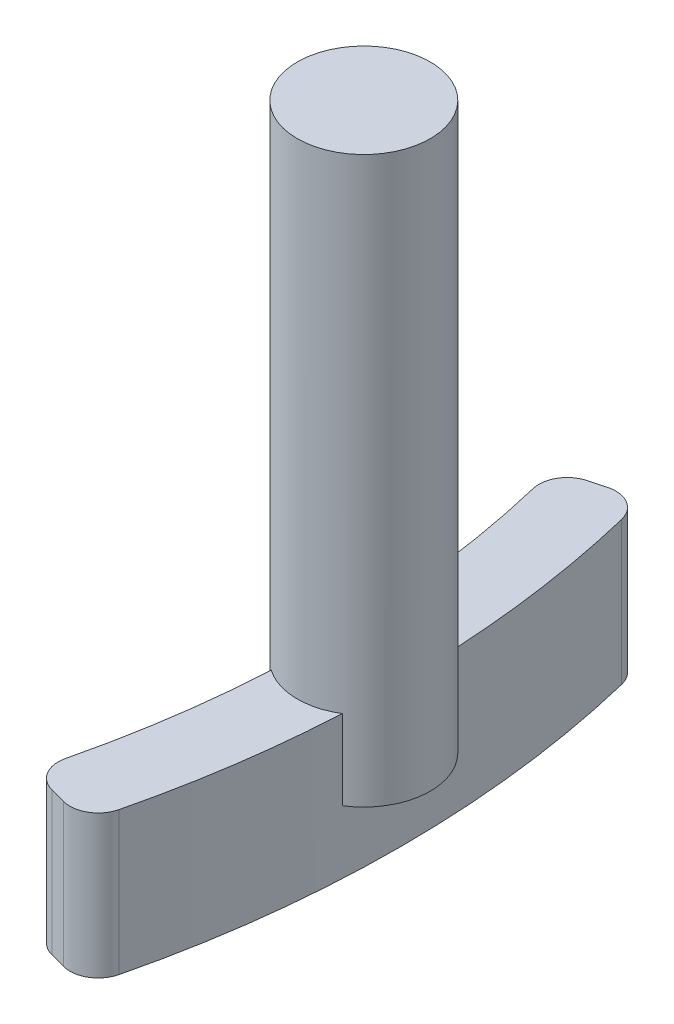
ISO-10303-21;
HEADER;
FILE_DESCRIPTION(('STEP AP214'),'2;1');
FILE_NAME('part.step','',(''),(''),'','','');
FILE_SCHEMA(('AUTOMOTIVE_DESIGN { 1 0 10303 214 1 1 1 1 }'));
ENDSEC;
DATA;
#1=APPLICATION_CONTEXT('core data for automotive mechanical design processes');
#2=APPLICATION_PROTOCOL_DEFINITION('international standard','automotive_design',2000,#1);
#3=PRODUCT_CONTEXT('',#1,'mechanical');
#4=PRODUCT('Part','Part','',(#3));
#5=PRODUCT_RELATED_PRODUCT_CATEGORY('part','',(#4));
#6=PRODUCT_DEFINITION_FORMATION('','',#4);
#7=PRODUCT_DEFINITION_CONTEXT('part definition',#1,'design');
#8=PRODUCT_DEFINITION('design','',#6,#7);
#9=PRODUCT_DEFINITION_SHAPE('','',#8);
#10=(LENGTH_UNIT() NAMED_UNIT(*) SI_UNIT(.MILLI.,.METRE.));
#11=(NAMED_UNIT(*) PLANE_ANGLE_UNIT() SI_UNIT($,.RADIAN.));
#12=(NAMED_UNIT(*) SI_UNIT($,.STERADIAN.) SOLID_ANGLE_UNIT());
#13=UNCERTAINTY_MEASURE_WITH_UNIT(LENGTH_MEASURE(1.E-05),#10,'distance_accuracy_value','');
#14=(GEOMETRIC_REPRESENTATION_CONTEXT(3) GLOBAL_UNCERTAINTY_ASSIGNED_CONTEXT((#13)) GLOBAL_UNIT_ASSIGNED_CONTEXT((#10,
#11,#12)) REPRESENTATION_CONTEXT('',''));
#15=CARTESIAN_POINT('',(0.,0.,0.));
#16=DIRECTION('',(0.,0.,1.));
#17=DIRECTION('',(1.,0.,0.));
#18=AXIS2_PLACEMENT_3D('',#15,#16,#17);
#19=CARTESIAN_POINT('',(-30.5687487202427,4.3,-6.82173660494919E-13));
#20=DIRECTION('',(0.,-1.,0.));
#21=DIRECTION('',(0.,0.,-1.));
#22=AXIS2_PLACEMENT_3D('',#19,#20,#21);
#23=CYLINDRICAL_SURFACE('',#22,32.0999999999997);
#24=DIRECTION('',(0.,-1.,0.));
#25=VECTOR('',#24,1.);
#26=CARTESIAN_POINT('',(1.48625127975695,10.4,1.69911006117922));
#27=LINE('',#26,#25);
#28=CARTESIAN_POINT('',(1.4862512797569,4.3,1.69911006117915));
#29=VERTEX_POINT('',#28);
#30=CARTESIAN_POINT('',(1.48625127975689,1.9,1.69911006117926));
#31=VERTEX_POINT('',#30);
#32=EDGE_CURVE('E201',#29,#31,#27,.T.);
#33=ORIENTED_EDGE('',*,*,#32,.F.);
#34=CARTESIAN_POINT('',(-30.5687487202427,4.3,-6.82173660494919E-13));
#35=DIRECTION('',(0.,1.,0.));
#36=DIRECTION('',(0.,0.,1.));
#37=AXIS2_PLACEMENT_3D('',#34,#35,#36);
#38=CIRCLE('',#37,32.0999999999997);
#39=CARTESIAN_POINT('',(0.627933418644134,4.3,7.56154901625497));
#40=VERTEX_POINT('',#39);
#41=EDGE_CURVE('E190',#40,#29,#38,.T.);
#42=ORIENTED_EDGE('',*,*,#41,.F.);
#43=DIRECTION('',(0.,-1.,0.));
#44=VECTOR('',#43,1.);
#45=CARTESIAN_POINT('',(0.627933418644134,4.3,7.56154901625497));
#46=LINE('',#45,#44);
#47=CARTESIAN_POINT('',(0.627933418644134,0.,7.56154901625497));
#48=VERTEX_POINT('',#47);
#49=EDGE_CURVE('E151',#40,#48,#46,.T.);
#50=ORIENTED_EDGE('',*,*,#49,.T.);
#51=CARTESIAN_POINT('',(-30.5687487202427,0.,-6.82173660494919E-13));
#52=DIRECTION('',(0.,1.,0.));
#53=DIRECTION('',(0.,0.,1.));
#54=AXIS2_PLACEMENT_3D('',#51,#52,#53);
#55=CIRCLE('',#54,32.0999999999997);
#56=CARTESIAN_POINT('',(0.627933418643905,0.,-7.56154901625722));
#57=VERTEX_POINT('',#56);
#58=EDGE_CURVE('E176',#48,#57,#55,.T.);
#59=ORIENTED_EDGE('',*,*,#58,.T.);
#60=DIRECTION('',(0.,-1.,0.));
#61=VECTOR('',#60,1.);
#62=CARTESIAN_POINT('',(0.627933418643905,4.3,-7.56154901625722));
#63=LINE('',#62,#61);
#64=CARTESIAN_POINT('',(0.627933418643905,4.3,-7.56154901625722));
#65=VERTEX_POINT('',#64);
#66=EDGE_CURVE('E154',#65,#57,#63,.T.);
#67=ORIENTED_EDGE('',*,*,#66,.F.);
#68=CARTESIAN_POINT('',(1.48625127975698,4.3,-1.6991100611791));
#69=VERTEX_POINT('',#68);
#70=EDGE_CURVE('E193',#69,#65,#38,.T.);
#71=ORIENTED_EDGE('',*,*,#70,.F.);
#72=DIRECTION('',(0.,-1.,0.));
#73=VECTOR('',#72,1.);
#74=CARTESIAN_POINT('',(1.48625127975702,10.4,-1.69911006117918));
#75=LINE('',#74,#73);
#76=CARTESIAN_POINT('',(1.48625127975697,1.9,-1.69911006117921));
#77=VERTEX_POINT('',#76);
#78=EDGE_CURVE('E48',#77,#69,#75,.F.);
#79=ORIENTED_EDGE('',*,*,#78,.F.);
#80=CARTESIAN_POINT('',(-30.5687487202427,1.9,-6.82173660494919E-13));
#81=DIRECTION('',(0.,1.,0.));
#82=DIRECTION('',(0.,0.,1.));
#83=AXIS2_PLACEMENT_3D('',#80,#81,#82);
#84=CIRCLE('',#83,32.0999999999997);
#85=EDGE_CURVE('E52',#31,#77,#84,.T.);
#86=ORIENTED_EDGE('',*,*,#85,.F.);
#87=EDGE_LOOP('',(#33,#42,#50,#59,#67,#71,#79,#86));
#88=FACE_BOUND('',#87,.T.);
#89=ADVANCED_FACE('F33',(#88),#23,.T.);
#90=CARTESIAN_POINT('',(-30.5687487202427,4.3,-6.82173660494919E-13));
#91=DIRECTION('',(0.,-1.,0.));
#92=DIRECTION('',(0.,0.,-1.));
#93=AXIS2_PLACEMENT_3D('',#90,#91,#92);
#94=CYLINDRICAL_SURFACE('',#93,29.8999999999998);
#95=DIRECTION('',(0.,-1.,0.));
#96=VECTOR('',#95,1.);
#97=CARTESIAN_POINT('',(-0.713748720242946,10.4,1.63980944014838));
#98=LINE('',#97,#96);
#99=CARTESIAN_POINT('',(-0.713748720242945,1.9,1.63980944014838));
#100=VERTEX_POINT('',#99);
#101=CARTESIAN_POINT('',(-0.713748720242945,4.3,1.63980944014838));
#102=VERTEX_POINT('',#101);
#103=EDGE_CURVE('E203',#100,#102,#98,.F.);
#104=ORIENTED_EDGE('',*,*,#103,.F.);
#105=CARTESIAN_POINT('',(-30.5687487202427,1.9,-6.82173660494919E-13));
#106=DIRECTION('',(0.,1.,0.));
#107=DIRECTION('',(0.,0.,1.));
#108=AXIS2_PLACEMENT_3D('',#105,#106,#107);
#109=CIRCLE('',#108,29.8999999999998);
#110=CARTESIAN_POINT('',(-0.713748720242873,1.9,-1.63980944014843));
#111=VERTEX_POINT('',#110);
#112=EDGE_CURVE('E11',#111,#100,#109,.F.);
#113=ORIENTED_EDGE('',*,*,#112,.F.);
#114=DIRECTION('',(0.,-1.,0.));
#115=VECTOR('',#114,1.);
#116=CARTESIAN_POINT('',(-0.713748720242871,10.4,-1.63980944014843));
#117=LINE('',#116,#115);
#118=CARTESIAN_POINT('',(-0.713748720242869,4.3,-1.63980944014843));
#119=VERTEX_POINT('',#118);
#120=EDGE_CURVE('E134',#119,#111,#117,.T.);
#121=ORIENTED_EDGE('',*,*,#120,.F.);
#122=CARTESIAN_POINT('',(-30.5687487202427,4.3,-6.82173660494919E-13));
#123=DIRECTION('',(0.,-1.,0.));
#124=DIRECTION('',(0.,0.,1.));
#125=AXIS2_PLACEMENT_3D('',#122,#123,#124);
#126=CIRCLE('',#125,29.8999999999998);
#127=CARTESIAN_POINT('',(-1.50740974559166,4.3,-7.03196821668193));
#128=VERTEX_POINT('',#127);
#129=EDGE_CURVE('E120',#128,#119,#126,.T.);
#130=ORIENTED_EDGE('',*,*,#129,.F.);
#131=DIRECTION('',(0.,-1.,0.));
#132=VECTOR('',#131,1.);
#133=CARTESIAN_POINT('',(-1.50740974559166,4.3,-7.03196821668193));
#134=LINE('',#133,#132);
#135=CARTESIAN_POINT('',(-1.50740974559166,0.,-7.03196821668193));
#136=VERTEX_POINT('',#135);
#137=EDGE_CURVE('E163',#128,#136,#134,.T.);
#138=ORIENTED_EDGE('',*,*,#137,.T.);
#139=CARTESIAN_POINT('',(-30.5687487202427,0.,-6.82173660494919E-13));
#140=DIRECTION('',(0.,-1.,0.));
#141=DIRECTION('',(0.,0.,1.));
#142=AXIS2_PLACEMENT_3D('',#139,#140,#141);
#143=CIRCLE('',#142,29.8999999999998);
#144=CARTESIAN_POINT('',(-1.50740974559173,0.,7.03196821668091));
#145=VERTEX_POINT('',#144);
#146=EDGE_CURVE('E167',#136,#145,#143,.T.);
#147=ORIENTED_EDGE('',*,*,#146,.T.);
#148=DIRECTION('',(0.,-1.,0.));
#149=VECTOR('',#148,1.);
#150=CARTESIAN_POINT('',(-1.50740974559173,4.3,7.03196821668091));
#151=LINE('',#150,#149);
#152=CARTESIAN_POINT('',(-1.50740974559173,4.3,7.03196821668091));
#153=VERTEX_POINT('',#152);
#154=EDGE_CURVE('E130',#153,#145,#151,.T.);
#155=ORIENTED_EDGE('',*,*,#154,.F.);
#156=EDGE_CURVE('E131',#102,#153,#126,.T.);
#157=ORIENTED_EDGE('',*,*,#156,.F.);
#158=EDGE_LOOP('',(#104,#113,#121,#130,#138,#147,#155,#157));
#159=FACE_BOUND('',#158,.T.);
#160=ADVANCED_FACE('F135',(#159),#94,.F.);
#161=CARTESIAN_POINT('',(-0.681251279757298,4.3,7.23187366765677));
#162=DIRECTION('',(0.,-1.,0.));
#163=DIRECTION('',(0.,0.,-1.));
#164=AXIS2_PLACEMENT_3D('',#161,#162,#163);
#165=PLANE('',#164);
#166=CARTESIAN_POINT('',(0.431251279757166,4.3,0.));
#167=DIRECTION('',(0.,-1.,0.));
#168=DIRECTION('',(0.,0.,-1.));
#169=AXIS2_PLACEMENT_3D('',#166,#167,#168);
#170=CIRCLE('',#169,2.);
#171=EDGE_CURVE('E41',#102,#29,#170,.F.);
#172=ORIENTED_EDGE('',*,*,#171,.F.);
#173=ORIENTED_EDGE('',*,*,#156,.T.);
#174=CARTESIAN_POINT('',(-0.681251279757298,4.3,7.23187366765677));
#175=DIRECTION('',(0.,1.,0.));
#176=DIRECTION('',(0.,0.,-1.));
#177=AXIS2_PLACEMENT_3D('',#174,#175,#176);
#178=CIRCLE('',#177,0.849999999999792);
#179=CARTESIAN_POINT('',(-0.901247468094085,4.3,8.0529106200023));
#180=VERTEX_POINT('',#179);
#181=EDGE_CURVE('E169',#153,#180,#178,.T.);
#182=ORIENTED_EDGE('',*,*,#181,.T.);
#183=DIRECTION('',(0.965925826289131,0.,0.258819045102288));
#184=VECTOR('',#183,1.);
#185=CARTESIAN_POINT('',(-0.901247468094085,4.3,8.0529106200023));
#186=LINE('',#185,#184);
#187=CARTESIAN_POINT('',(-0.418143137857351,4.3,8.18235803514908));
#188=VERTEX_POINT('',#187);
#189=EDGE_CURVE('E196',#180,#188,#186,.T.);
#190=ORIENTED_EDGE('',*,*,#189,.T.);
#191=CARTESIAN_POINT('',(-0.198146949520289,4.3,7.36132108280253));
#192=DIRECTION('',(0.,1.,0.));
#193=DIRECTION('',(0.,0.,-1.));
#194=AXIS2_PLACEMENT_3D('',#191,#192,#193);
#195=CIRCLE('',#194,0.850000000000766);
#196=EDGE_CURVE('E194',#188,#40,#195,.T.);
#197=ORIENTED_EDGE('',*,*,#196,.T.);
#198=ORIENTED_EDGE('',*,*,#41,.T.);
#199=EDGE_LOOP('',(#172,#173,#182,#190,#197,#198));
#200=FACE_BOUND('',#199,.T.);
#201=ADVANCED_FACE('F232',(#200),#165,.F.);
#202=CARTESIAN_POINT('',(-0.681251279757298,4.3,7.23187366765677));
#203=DIRECTION('',(0.,-1.,0.));
#204=DIRECTION('',(0.,0.,-1.));
#205=AXIS2_PLACEMENT_3D('',#202,#203,#204);
#206=CYLINDRICAL_SURFACE('',#205,0.849999999999792);
#207=CARTESIAN_POINT('',(-0.681251279757298,0.,7.23187366765677));
#208=DIRECTION('',(0.,1.,0.));
#209=DIRECTION('',(0.,0.,-1.));
#210=AXIS2_PLACEMENT_3D('',#207,#208,#209);
#211=CIRCLE('',#210,0.849999999999792);
#212=CARTESIAN_POINT('',(-0.901247468094085,0.,8.0529106200023));
#213=VERTEX_POINT('',#212);
#214=EDGE_CURVE('E182',#145,#213,#211,.T.);
#215=ORIENTED_EDGE('',*,*,#214,.T.);
#216=DIRECTION('',(0.,-1.,0.));
#217=VECTOR('',#216,1.);
#218=CARTESIAN_POINT('',(-0.901247468094085,4.3,8.0529106200023));
#219=LINE('',#218,#217);
#220=EDGE_CURVE('E144',#180,#213,#219,.T.);
#221=ORIENTED_EDGE('',*,*,#220,.F.);
#222=ORIENTED_EDGE('',*,*,#181,.F.);
#223=ORIENTED_EDGE('',*,*,#154,.T.);
#224=EDGE_LOOP('',(#215,#221,#222,#223));
#225=FACE_BOUND('',#224,.T.);
#226=ADVANCED_FACE('F35',(#225),#206,.T.);
#227=CARTESIAN_POINT('',(-0.901247468094085,4.3,8.0529106200023));
#228=DIRECTION('',(0.258819045102288,0.,-0.965925826289131));
#229=DIRECTION('',(-0.965925826289131,0.,-0.258819045102288));
#230=AXIS2_PLACEMENT_3D('',#227,#228,#229);
#231=PLANE('',#230);
#232=DIRECTION('',(0.965925826289131,0.,0.258819045102288));
#233=VECTOR('',#232,1.);
#234=CARTESIAN_POINT('',(-0.901247468094085,0.,8.0529106200023));
#235=LINE('',#234,#233);
#236=CARTESIAN_POINT('',(-0.418143137857351,0.,8.18235803514908));
#237=VERTEX_POINT('',#236);
#238=EDGE_CURVE('E180',#213,#237,#235,.T.);
#239=ORIENTED_EDGE('',*,*,#238,.T.);
#240=DIRECTION('',(0.,-1.,0.));
#241=VECTOR('',#240,1.);
#242=CARTESIAN_POINT('',(-0.418143137857351,4.3,8.18235803514908));
#243=LINE('',#242,#241);
#244=EDGE_CURVE('E146',#188,#237,#243,.T.);
#245=ORIENTED_EDGE('',*,*,#244,.F.);
#246=ORIENTED_EDGE('',*,*,#189,.F.);
#247=ORIENTED_EDGE('',*,*,#220,.T.);
#248=EDGE_LOOP('',(#239,#245,#246,#247));
#249=FACE_BOUND('',#248,.T.);
#250=ADVANCED_FACE('F240',(#249),#231,.F.);
#251=CARTESIAN_POINT('',(-0.198146949520289,4.3,7.36132108280253));
#252=DIRECTION('',(0.,-1.,0.));
#253=DIRECTION('',(0.,0.,-1.));
#254=AXIS2_PLACEMENT_3D('',#251,#252,#253);
#255=CYLINDRICAL_SURFACE('',#254,0.850000000000766);
#256=CARTESIAN_POINT('',(-0.198146949520289,0.,7.36132108280253));
#257=DIRECTION('',(0.,1.,0.));
#258=DIRECTION('',(0.,0.,-1.));
#259=AXIS2_PLACEMENT_3D('',#256,#257,#258);
#260=CIRCLE('',#259,0.850000000000766);
#261=EDGE_CURVE('E178',#237,#48,#260,.T.);
#262=ORIENTED_EDGE('',*,*,#261,.T.);
#263=ORIENTED_EDGE('',*,*,#49,.F.);
#264=ORIENTED_EDGE('',*,*,#196,.F.);
#265=ORIENTED_EDGE('',*,*,#244,.T.);
#266=EDGE_LOOP('',(#262,#263,#264,#265));
#267=FACE_BOUND('',#266,.T.);
#268=ADVANCED_FACE('F238',(#267),#255,.T.);
#269=CARTESIAN_POINT('',(-0.198146949519636,4.3,-7.36132108280495));
#270=DIRECTION('',(0.,-1.,0.));
#271=DIRECTION('',(0.,0.,-1.));
#272=AXIS2_PLACEMENT_3D('',#269,#270,#271);
#273=CYLINDRICAL_SURFACE('',#272,0.8499999999999);
#274=CARTESIAN_POINT('',(-0.198146949519636,0.,-7.36132108280495));
#275=DIRECTION('',(0.,1.,0.));
#276=DIRECTION('',(0.,0.,-1.));
#277=AXIS2_PLACEMENT_3D('',#274,#275,#276);
#278=CIRCLE('',#277,0.8499999999999);
#279=CARTESIAN_POINT('',(-0.418143137856753,0.,-8.18235803515056));
#280=VERTEX_POINT('',#279);
#281=EDGE_CURVE('E174',#57,#280,#278,.T.);
#282=ORIENTED_EDGE('',*,*,#281,.T.);
#283=DIRECTION('',(0.,-1.,0.));
#284=VECTOR('',#283,1.);
#285=CARTESIAN_POINT('',(-0.418143137856753,4.3,-8.18235803515056));
#286=LINE('',#285,#284);
#287=CARTESIAN_POINT('',(-0.418143137856753,4.3,-8.18235803515056));
#288=VERTEX_POINT('',#287);
#289=EDGE_CURVE('E157',#288,#280,#286,.T.);
#290=ORIENTED_EDGE('',*,*,#289,.F.);
#291=CARTESIAN_POINT('',(-0.198146949519636,4.3,-7.36132108280495));
#292=DIRECTION('',(0.,1.,0.));
#293=DIRECTION('',(0.,0.,-1.));
#294=AXIS2_PLACEMENT_3D('',#291,#292,#293);
#295=CIRCLE('',#294,0.8499999999999);
#296=EDGE_CURVE('E188',#65,#288,#295,.T.);
#297=ORIENTED_EDGE('',*,*,#296,.F.);
#298=ORIENTED_EDGE('',*,*,#66,.T.);
#299=EDGE_LOOP('',(#282,#290,#297,#298));
#300=FACE_BOUND('',#299,.T.);
#301=ADVANCED_FACE('F236',(#300),#273,.T.);
#302=CARTESIAN_POINT('',(-0.901247468094234,4.3,-8.05291062000355));
#303=DIRECTION('',(0.258819045102377,0.,0.965925826289107));
#304=DIRECTION('',(0.965925826289107,0.,-0.258819045102377));
#305=AXIS2_PLACEMENT_3D('',#302,#303,#304);
#306=PLANE('',#305);
#307=DIRECTION('',(-0.965925826289107,0.,0.258819045102377));
#308=VECTOR('',#307,1.);
#309=CARTESIAN_POINT('',(-0.901247468094234,0.,-8.05291062000355));
#310=LINE('',#309,#308);
#311=CARTESIAN_POINT('',(-0.901247468094234,0.,-8.05291062000355));
#312=VERTEX_POINT('',#311);
#313=EDGE_CURVE('E172',#280,#312,#310,.T.);
#314=ORIENTED_EDGE('',*,*,#313,.T.);
#315=DIRECTION('',(0.,-1.,0.));
#316=VECTOR('',#315,1.);
#317=CARTESIAN_POINT('',(-0.901247468094234,4.3,-8.05291062000355));
#318=LINE('',#317,#316);
#319=CARTESIAN_POINT('',(-0.901247468094234,4.3,-8.05291062000355));
#320=VERTEX_POINT('',#319);
#321=EDGE_CURVE('E160',#320,#312,#318,.T.);
#322=ORIENTED_EDGE('',*,*,#321,.F.);
#323=DIRECTION('',(-0.965925826289107,0.,0.258819045102377));
#324=VECTOR('',#323,1.);
#325=CARTESIAN_POINT('',(-0.901247468094234,4.3,-8.05291062000355));
#326=LINE('',#325,#324);
#327=EDGE_CURVE('E186',#288,#320,#326,.T.);
#328=ORIENTED_EDGE('',*,*,#327,.F.);
#329=ORIENTED_EDGE('',*,*,#289,.T.);
#330=EDGE_LOOP('',(#314,#322,#328,#329));
#331=FACE_BOUND('',#330,.T.);
#332=ADVANCED_FACE('F267',(#331),#306,.F.);
#333=CARTESIAN_POINT('',(-0.681251279757095,4.3,-7.23187366765784));
#334=DIRECTION('',(0.,-1.,0.));
#335=DIRECTION('',(0.,0.,-1.));
#336=AXIS2_PLACEMENT_3D('',#333,#334,#335);
#337=CYLINDRICAL_SURFACE('',#336,0.850000000000002);
#338=CARTESIAN_POINT('',(-0.681251279757095,0.,-7.23187366765784));
#339=DIRECTION('',(0.,1.,0.));
#340=DIRECTION('',(0.,0.,1.));
#341=AXIS2_PLACEMENT_3D('',#338,#339,#340);
#342=CIRCLE('',#341,0.850000000000002);
#343=EDGE_CURVE('E170',#312,#136,#342,.T.);
#344=ORIENTED_EDGE('',*,*,#343,.T.);
#345=ORIENTED_EDGE('',*,*,#137,.F.);
#346=CARTESIAN_POINT('',(-0.681251279757095,4.3,-7.23187366765784));
#347=DIRECTION('',(0.,1.,0.));
#348=DIRECTION('',(0.,0.,1.));
#349=AXIS2_PLACEMENT_3D('',#346,#347,#348);
#350=CIRCLE('',#349,0.850000000000002);
#351=EDGE_CURVE('E126',#320,#128,#350,.T.);
#352=ORIENTED_EDGE('',*,*,#351,.F.);
#353=ORIENTED_EDGE('',*,*,#321,.T.);
#354=EDGE_LOOP('',(#344,#345,#352,#353));
#355=FACE_BOUND('',#354,.T.);
#356=ADVANCED_FACE('F270',(#355),#337,.T.);
#357=EDGE_CURVE('E124',#69,#119,#170,.F.);
#358=ORIENTED_EDGE('',*,*,#357,.F.);
#359=ORIENTED_EDGE('',*,*,#70,.T.);
#360=ORIENTED_EDGE('',*,*,#296,.T.);
#361=ORIENTED_EDGE('',*,*,#327,.T.);
#362=ORIENTED_EDGE('',*,*,#351,.T.);
#363=ORIENTED_EDGE('',*,*,#129,.T.);
#364=EDGE_LOOP('',(#358,#359,#360,#361,#362,#363));
#365=FACE_BOUND('',#364,.T.);
#366=ADVANCED_FACE('F122',(#365),#165,.F.);
#367=CARTESIAN_POINT('',(-0.681251279757298,0.,7.23187366765677));
#368=DIRECTION('',(0.,-1.,0.));
#369=DIRECTION('',(0.,0.,-1.));
#370=AXIS2_PLACEMENT_3D('',#367,#368,#369);
#371=PLANE('',#370);
#372=ORIENTED_EDGE('',*,*,#214,.F.);
#373=ORIENTED_EDGE('',*,*,#146,.F.);
#374=ORIENTED_EDGE('',*,*,#343,.F.);
#375=ORIENTED_EDGE('',*,*,#313,.F.);
#376=ORIENTED_EDGE('',*,*,#281,.F.);
#377=ORIENTED_EDGE('',*,*,#58,.F.);
#378=ORIENTED_EDGE('',*,*,#261,.F.);
#379=ORIENTED_EDGE('',*,*,#238,.F.);
#380=EDGE_LOOP('',(#372,#373,#374,#375,#376,#377,#378,#379));
#381=FACE_BOUND('',#380,.T.);
#382=ADVANCED_FACE('F256',(#381),#371,.T.);
#383=CARTESIAN_POINT('',(0.431251279757166,1.9,0.));
#384=DIRECTION('',(0.,1.,0.));
#385=DIRECTION('',(0.,0.,1.));
#386=AXIS2_PLACEMENT_3D('',#383,#384,#385);
#387=PLANE('',#386);
#388=CARTESIAN_POINT('',(0.431251279757166,1.9,0.));
#389=DIRECTION('',(0.,1.,0.));
#390=DIRECTION('',(0.,0.,1.));
#391=AXIS2_PLACEMENT_3D('',#388,#389,#390);
#392=CIRCLE('',#391,2.);
#393=EDGE_CURVE('E207',#31,#77,#392,.T.);
#394=ORIENTED_EDGE('',*,*,#393,.F.);
#395=ORIENTED_EDGE('',*,*,#85,.T.);
#396=EDGE_LOOP('',(#394,#395));
#397=FACE_BOUND('',#396,.T.);
#398=ADVANCED_FACE('F223',(#397),#387,.F.);
#399=EDGE_CURVE('E209',#111,#100,#392,.T.);
#400=ORIENTED_EDGE('',*,*,#399,.F.);
#401=ORIENTED_EDGE('',*,*,#112,.T.);
#402=EDGE_LOOP('',(#400,#401));
#403=FACE_BOUND('',#402,.T.);
#404=ADVANCED_FACE('F216',(#403),#387,.F.);
#405=CARTESIAN_POINT('',(0.431251279757166,18.9,0.));
#406=DIRECTION('',(0.,-1.,0.));
#407=DIRECTION('',(0.,0.,-1.));
#408=AXIS2_PLACEMENT_3D('',#405,#406,#407);
#409=CYLINDRICAL_SURFACE('',#408,2.);
#410=CARTESIAN_POINT('',(0.431251279757166,18.9,0.));
#411=DIRECTION('',(0.,1.,0.));
#412=DIRECTION('',(0.,0.,1.));
#413=AXIS2_PLACEMENT_3D('',#410,#411,#412);
#414=CIRCLE('',#413,2.);
#415=CARTESIAN_POINT('',(0.431251279757166,18.9,2.));
#416=VERTEX_POINT('',#415);
#417=EDGE_CURVE('E139',#416,#416,#414,.T.);
#418=ORIENTED_EDGE('',*,*,#417,.F.);
#419=EDGE_LOOP('',(#418));
#420=FACE_BOUND('',#419,.T.);
#421=ORIENTED_EDGE('',*,*,#171,.T.);
#422=ORIENTED_EDGE('',*,*,#32,.T.);
#423=ORIENTED_EDGE('',*,*,#393,.T.);
#424=ORIENTED_EDGE('',*,*,#78,.T.);
#425=ORIENTED_EDGE('',*,*,#357,.T.);
#426=ORIENTED_EDGE('',*,*,#120,.T.);
#427=ORIENTED_EDGE('',*,*,#399,.T.);
#428=ORIENTED_EDGE('',*,*,#103,.T.);
#429=EDGE_LOOP('',(#421,#422,#423,#424,#425,#426,#427,#428));
#430=FACE_BOUND('',#429,.T.);
#431=ADVANCED_FACE('F142',(#420,#430),#409,.T.);
#432=CARTESIAN_POINT('',(0.431251279757166,18.9,0.));
#433=DIRECTION('',(0.,1.,0.));
#434=DIRECTION('',(0.,0.,1.));
#435=AXIS2_PLACEMENT_3D('',#432,#433,#434);
#436=PLANE('',#435);
#437=ORIENTED_EDGE('',*,*,#417,.T.);
#438=EDGE_LOOP('',(#437));
#439=FACE_BOUND('',#438,.T.);
#440=ADVANCED_FACE('F213',(#439),#436,.T.);
#441=CLOSED_SHELL('',(#89,#160,#201,#226,#250,#268,#301,#332,#356,#366,#382,#398,#404,#431,#440));
#442=MANIFOLD_SOLID_BREP('B2',#441);
#443=ADVANCED_BREP_SHAPE_REPRESENTATION('',(#18,#442),#14);
#444=SHAPE_DEFINITION_REPRESENTATION(#9,#443);
ENDSEC;
END-ISO-10303-21;
